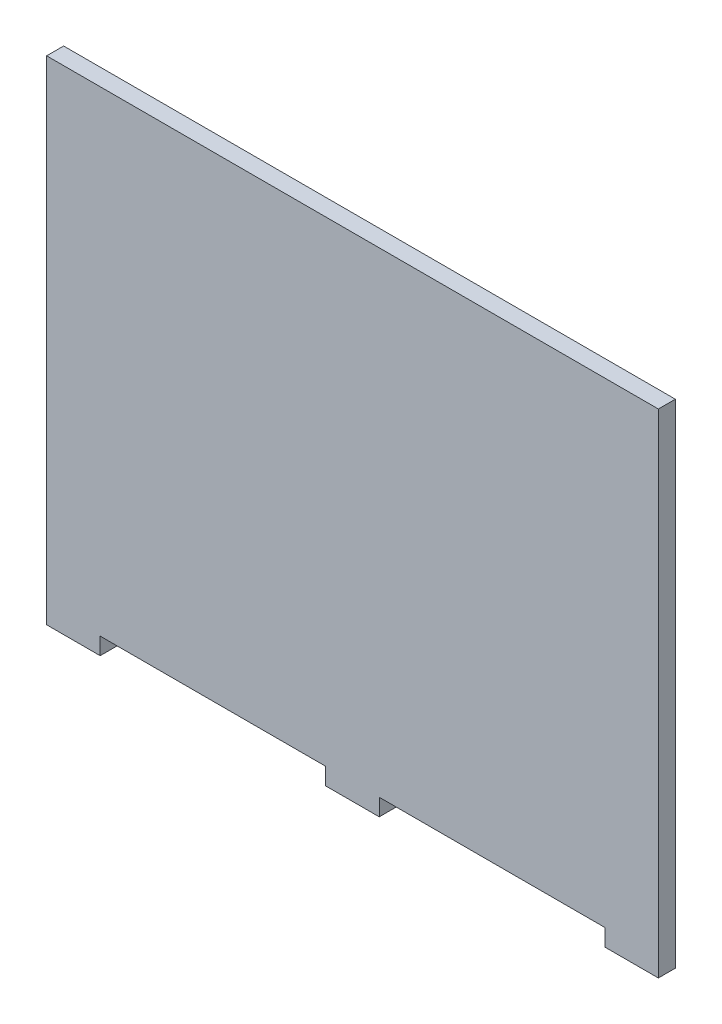
ISO-10303-21;
HEADER;
FILE_DESCRIPTION(('STEP AP214'),'2;1');
FILE_NAME('part.step','',(''),(''),'','','');
FILE_SCHEMA(('AUTOMOTIVE_DESIGN { 1 0 10303 214 1 1 1 1 }'));
ENDSEC;
DATA;
#1=APPLICATION_CONTEXT('core data for automotive mechanical design processes');
#2=APPLICATION_PROTOCOL_DEFINITION('international standard','automotive_design',2000,#1);
#3=PRODUCT_CONTEXT('',#1,'mechanical');
#4=PRODUCT('Part','Part','',(#3));
#5=PRODUCT_RELATED_PRODUCT_CATEGORY('part','',(#4));
#6=PRODUCT_DEFINITION_FORMATION('','',#4);
#7=PRODUCT_DEFINITION_CONTEXT('part definition',#1,'design');
#8=PRODUCT_DEFINITION('design','',#6,#7);
#9=PRODUCT_DEFINITION_SHAPE('','',#8);
#10=(LENGTH_UNIT() NAMED_UNIT(*) SI_UNIT(.MILLI.,.METRE.));
#11=(NAMED_UNIT(*) PLANE_ANGLE_UNIT() SI_UNIT($,.RADIAN.));
#12=(NAMED_UNIT(*) SI_UNIT($,.STERADIAN.) SOLID_ANGLE_UNIT());
#13=UNCERTAINTY_MEASURE_WITH_UNIT(LENGTH_MEASURE(1.E-05),#10,'distance_accuracy_value','');
#14=(GEOMETRIC_REPRESENTATION_CONTEXT(3) GLOBAL_UNCERTAINTY_ASSIGNED_CONTEXT((#13)) GLOBAL_UNIT_ASSIGNED_CONTEXT((#10,
#11,#12)) REPRESENTATION_CONTEXT('',''));
#15=CARTESIAN_POINT('',(0.,0.,0.));
#16=DIRECTION('',(0.,0.,1.));
#17=DIRECTION('',(1.,0.,0.));
#18=AXIS2_PLACEMENT_3D('',#15,#16,#17);
#19=CARTESIAN_POINT('',(114.3,0.,-6.35));
#20=DIRECTION('',(1.,0.,0.));
#21=DIRECTION('',(0.,0.,-1.));
#22=AXIS2_PLACEMENT_3D('',#19,#20,#21);
#23=PLANE('',#22);
#24=DIRECTION('',(0.,1.,0.));
#25=VECTOR('',#24,1.);
#26=CARTESIAN_POINT('',(114.3,0.,0.));
#27=LINE('',#26,#25);
#28=CARTESIAN_POINT('',(114.3,-6.35,0.));
#29=VERTEX_POINT('',#28);
#30=CARTESIAN_POINT('',(114.3,177.8,0.));
#31=VERTEX_POINT('',#30);
#32=EDGE_CURVE('E152',#29,#31,#27,.T.);
#33=ORIENTED_EDGE('',*,*,#32,.F.);
#34=DIRECTION('',(0.,0.,1.));
#35=VECTOR('',#34,1.);
#36=CARTESIAN_POINT('',(114.3,-6.35,-6.35));
#37=LINE('',#36,#35);
#38=CARTESIAN_POINT('',(114.3,-6.35,-6.35));
#39=VERTEX_POINT('',#38);
#40=EDGE_CURVE('E11',#39,#29,#37,.T.);
#41=ORIENTED_EDGE('',*,*,#40,.F.);
#42=DIRECTION('',(0.,1.,0.));
#43=VECTOR('',#42,1.);
#44=CARTESIAN_POINT('',(114.3,0.,-6.35));
#45=LINE('',#44,#43);
#46=CARTESIAN_POINT('',(114.3,177.8,-6.35));
#47=VERTEX_POINT('',#46);
#48=EDGE_CURVE('E182',#39,#47,#45,.T.);
#49=ORIENTED_EDGE('',*,*,#48,.T.);
#50=DIRECTION('',(0.,0.,1.));
#51=VECTOR('',#50,1.);
#52=CARTESIAN_POINT('',(114.3,177.8,-6.35));
#53=LINE('',#52,#51);
#54=EDGE_CURVE('E38',#47,#31,#53,.T.);
#55=ORIENTED_EDGE('',*,*,#54,.T.);
#56=EDGE_LOOP('',(#33,#41,#49,#55));
#57=FACE_BOUND('',#56,.T.);
#58=ADVANCED_FACE('F35',(#57),#23,.T.);
#59=CARTESIAN_POINT('',(0.,-6.35,-6.35));
#60=DIRECTION('',(0.,-1.,0.));
#61=DIRECTION('',(0.,0.,-1.));
#62=AXIS2_PLACEMENT_3D('',#59,#60,#61);
#63=PLANE('',#62);
#64=DIRECTION('',(1.,0.,0.));
#65=VECTOR('',#64,1.);
#66=CARTESIAN_POINT('',(0.,-6.35,0.));
#67=LINE('',#66,#65);
#68=CARTESIAN_POINT('',(94.3,-6.35,0.));
#69=VERTEX_POINT('',#68);
#70=EDGE_CURVE('E180',#69,#29,#67,.T.);
#71=ORIENTED_EDGE('',*,*,#70,.F.);
#72=DIRECTION('',(0.,0.,1.));
#73=VECTOR('',#72,1.);
#74=CARTESIAN_POINT('',(94.3,-6.35,-6.35));
#75=LINE('',#74,#73);
#76=CARTESIAN_POINT('',(94.3,-6.35,-6.35));
#77=VERTEX_POINT('',#76);
#78=EDGE_CURVE('E44',#77,#69,#75,.T.);
#79=ORIENTED_EDGE('',*,*,#78,.F.);
#80=DIRECTION('',(1.,0.,0.));
#81=VECTOR('',#80,1.);
#82=CARTESIAN_POINT('',(0.,-6.35,-6.35));
#83=LINE('',#82,#81);
#84=EDGE_CURVE('E147',#77,#39,#83,.T.);
#85=ORIENTED_EDGE('',*,*,#84,.T.);
#86=ORIENTED_EDGE('',*,*,#40,.T.);
#87=EDGE_LOOP('',(#71,#79,#85,#86));
#88=FACE_BOUND('',#87,.T.);
#89=ADVANCED_FACE('F207',(#88),#63,.T.);
#90=CARTESIAN_POINT('',(94.3,0.,-6.35));
#91=DIRECTION('',(-1.,0.,0.));
#92=DIRECTION('',(0.,0.,1.));
#93=AXIS2_PLACEMENT_3D('',#90,#91,#92);
#94=PLANE('',#93);
#95=DIRECTION('',(0.,-1.,0.));
#96=VECTOR('',#95,1.);
#97=CARTESIAN_POINT('',(94.3,0.,0.));
#98=LINE('',#97,#96);
#99=CARTESIAN_POINT('',(94.3,0.,0.));
#100=VERTEX_POINT('',#99);
#101=EDGE_CURVE('E134',#100,#69,#98,.T.);
#102=ORIENTED_EDGE('',*,*,#101,.F.);
#103=DIRECTION('',(0.,0.,1.));
#104=VECTOR('',#103,1.);
#105=CARTESIAN_POINT('',(94.3,0.,-6.35));
#106=LINE('',#105,#104);
#107=CARTESIAN_POINT('',(94.3,0.,-6.35));
#108=VERTEX_POINT('',#107);
#109=EDGE_CURVE('E128',#108,#100,#106,.T.);
#110=ORIENTED_EDGE('',*,*,#109,.F.);
#111=DIRECTION('',(0.,-1.,0.));
#112=VECTOR('',#111,1.);
#113=CARTESIAN_POINT('',(94.3,0.,-6.35));
#114=LINE('',#113,#112);
#115=EDGE_CURVE('E132',#108,#77,#114,.T.);
#116=ORIENTED_EDGE('',*,*,#115,.T.);
#117=ORIENTED_EDGE('',*,*,#78,.T.);
#118=EDGE_LOOP('',(#102,#110,#116,#117));
#119=FACE_BOUND('',#118,.T.);
#120=ADVANCED_FACE('F130',(#119),#94,.T.);
#121=CARTESIAN_POINT('',(0.,0.,-6.35));
#122=DIRECTION('',(0.,1.,0.));
#123=DIRECTION('',(0.,0.,1.));
#124=AXIS2_PLACEMENT_3D('',#121,#122,#123);
#125=PLANE('',#124);
#126=DIRECTION('',(-1.,0.,0.));
#127=VECTOR('',#126,1.);
#128=CARTESIAN_POINT('',(0.,0.,0.));
#129=LINE('',#128,#127);
#130=CARTESIAN_POINT('',(9.99999999999999,0.,0.));
#131=VERTEX_POINT('',#130);
#132=EDGE_CURVE('E177',#100,#131,#129,.T.);
#133=ORIENTED_EDGE('',*,*,#132,.T.);
#134=DIRECTION('',(0.,0.,1.));
#135=VECTOR('',#134,1.);
#136=CARTESIAN_POINT('',(9.99999999999999,0.,-6.35));
#137=LINE('',#136,#135);
#138=CARTESIAN_POINT('',(9.99999999999999,0.,-6.35));
#139=VERTEX_POINT('',#138);
#140=EDGE_CURVE('E137',#139,#131,#137,.T.);
#141=ORIENTED_EDGE('',*,*,#140,.F.);
#142=DIRECTION('',(-1.,0.,0.));
#143=VECTOR('',#142,1.);
#144=CARTESIAN_POINT('',(0.,0.,-6.35));
#145=LINE('',#144,#143);
#146=EDGE_CURVE('E140',#108,#139,#145,.T.);
#147=ORIENTED_EDGE('',*,*,#146,.F.);
#148=ORIENTED_EDGE('',*,*,#109,.T.);
#149=EDGE_LOOP('',(#133,#141,#147,#148));
#150=FACE_BOUND('',#149,.T.);
#151=ADVANCED_FACE('F141',(#150),#125,.F.);
#152=CARTESIAN_POINT('',(9.99999999999999,0.,-6.35));
#153=DIRECTION('',(-1.,0.,0.));
#154=DIRECTION('',(0.,0.,1.));
#155=AXIS2_PLACEMENT_3D('',#152,#153,#154);
#156=PLANE('',#155);
#157=DIRECTION('',(0.,-1.,0.));
#158=VECTOR('',#157,1.);
#159=CARTESIAN_POINT('',(9.99999999999999,0.,0.));
#160=LINE('',#159,#158);
#161=CARTESIAN_POINT('',(9.99999999999999,-6.35,0.));
#162=VERTEX_POINT('',#161);
#163=EDGE_CURVE('E174',#131,#162,#160,.T.);
#164=ORIENTED_EDGE('',*,*,#163,.T.);
#165=DIRECTION('',(0.,0.,1.));
#166=VECTOR('',#165,1.);
#167=CARTESIAN_POINT('',(9.99999999999999,-6.35,-6.35));
#168=LINE('',#167,#166);
#169=CARTESIAN_POINT('',(9.99999999999999,-6.35,-6.35));
#170=VERTEX_POINT('',#169);
#171=EDGE_CURVE('E186',#170,#162,#168,.T.);
#172=ORIENTED_EDGE('',*,*,#171,.F.);
#173=DIRECTION('',(0.,-1.,0.));
#174=VECTOR('',#173,1.);
#175=CARTESIAN_POINT('',(9.99999999999999,0.,-6.35));
#176=LINE('',#175,#174);
#177=EDGE_CURVE('E144',#139,#170,#176,.T.);
#178=ORIENTED_EDGE('',*,*,#177,.F.);
#179=ORIENTED_EDGE('',*,*,#140,.T.);
#180=EDGE_LOOP('',(#164,#172,#178,#179));
#181=FACE_BOUND('',#180,.T.);
#182=ADVANCED_FACE('F220',(#181),#156,.F.);
#183=CARTESIAN_POINT('',(0.,-6.35,-6.35));
#184=DIRECTION('',(0.,-1.,0.));
#185=DIRECTION('',(0.,0.,-1.));
#186=AXIS2_PLACEMENT_3D('',#183,#184,#185);
#187=PLANE('',#186);
#188=DIRECTION('',(1.,0.,0.));
#189=VECTOR('',#188,1.);
#190=CARTESIAN_POINT('',(0.,-6.35,0.));
#191=LINE('',#190,#189);
#192=CARTESIAN_POINT('',(-10.,-6.35,0.));
#193=VERTEX_POINT('',#192);
#194=EDGE_CURVE('E171',#193,#162,#191,.T.);
#195=ORIENTED_EDGE('',*,*,#194,.F.);
#196=DIRECTION('',(0.,0.,1.));
#197=VECTOR('',#196,1.);
#198=CARTESIAN_POINT('',(-10.,-6.35,-6.35));
#199=LINE('',#198,#197);
#200=CARTESIAN_POINT('',(-10.,-6.35,-6.35));
#201=VERTEX_POINT('',#200);
#202=EDGE_CURVE('E188',#201,#193,#199,.T.);
#203=ORIENTED_EDGE('',*,*,#202,.F.);
#204=DIRECTION('',(1.,0.,0.));
#205=VECTOR('',#204,1.);
#206=CARTESIAN_POINT('',(0.,-6.35,-6.35));
#207=LINE('',#206,#205);
#208=EDGE_CURVE('E400',#201,#170,#207,.T.);
#209=ORIENTED_EDGE('',*,*,#208,.T.);
#210=ORIENTED_EDGE('',*,*,#171,.T.);
#211=EDGE_LOOP('',(#195,#203,#209,#210));
#212=FACE_BOUND('',#211,.T.);
#213=ADVANCED_FACE('F223',(#212),#187,.T.);
#214=CARTESIAN_POINT('',(-10.,0.,-6.35));
#215=DIRECTION('',(-1.,0.,0.));
#216=DIRECTION('',(0.,0.,1.));
#217=AXIS2_PLACEMENT_3D('',#214,#215,#216);
#218=PLANE('',#217);
#219=DIRECTION('',(0.,-1.,0.));
#220=VECTOR('',#219,1.);
#221=CARTESIAN_POINT('',(-10.,0.,0.));
#222=LINE('',#221,#220);
#223=CARTESIAN_POINT('',(-10.,0.,0.));
#224=VERTEX_POINT('',#223);
#225=EDGE_CURVE('E168',#224,#193,#222,.T.);
#226=ORIENTED_EDGE('',*,*,#225,.F.);
#227=DIRECTION('',(0.,0.,1.));
#228=VECTOR('',#227,1.);
#229=CARTESIAN_POINT('',(-10.,0.,-6.35));
#230=LINE('',#229,#228);
#231=CARTESIAN_POINT('',(-10.,0.,-6.35));
#232=VERTEX_POINT('',#231);
#233=EDGE_CURVE('E190',#232,#224,#230,.T.);
#234=ORIENTED_EDGE('',*,*,#233,.F.);
#235=DIRECTION('',(0.,-1.,0.));
#236=VECTOR('',#235,1.);
#237=CARTESIAN_POINT('',(-10.,0.,-6.35));
#238=LINE('',#237,#236);
#239=EDGE_CURVE('E395',#232,#201,#238,.T.);
#240=ORIENTED_EDGE('',*,*,#239,.T.);
#241=ORIENTED_EDGE('',*,*,#202,.T.);
#242=EDGE_LOOP('',(#226,#234,#240,#241));
#243=FACE_BOUND('',#242,.T.);
#244=ADVANCED_FACE('F227',(#243),#218,.T.);
#245=CARTESIAN_POINT('',(0.,0.,-6.35));
#246=DIRECTION('',(0.,1.,0.));
#247=DIRECTION('',(0.,0.,1.));
#248=AXIS2_PLACEMENT_3D('',#245,#246,#247);
#249=PLANE('',#248);
#250=DIRECTION('',(-1.,0.,0.));
#251=VECTOR('',#250,1.);
#252=CARTESIAN_POINT('',(0.,0.,0.));
#253=LINE('',#252,#251);
#254=CARTESIAN_POINT('',(-94.3,0.,0.));
#255=VERTEX_POINT('',#254);
#256=EDGE_CURVE('E166',#224,#255,#253,.T.);
#257=ORIENTED_EDGE('',*,*,#256,.T.);
#258=DIRECTION('',(0.,0.,1.));
#259=VECTOR('',#258,1.);
#260=CARTESIAN_POINT('',(-94.3,0.,-6.35));
#261=LINE('',#260,#259);
#262=CARTESIAN_POINT('',(-94.3,0.,-6.35));
#263=VERTEX_POINT('',#262);
#264=EDGE_CURVE('E192',#263,#255,#261,.T.);
#265=ORIENTED_EDGE('',*,*,#264,.F.);
#266=DIRECTION('',(-1.,0.,0.));
#267=VECTOR('',#266,1.);
#268=CARTESIAN_POINT('',(0.,0.,-6.35));
#269=LINE('',#268,#267);
#270=EDGE_CURVE('E404',#232,#263,#269,.T.);
#271=ORIENTED_EDGE('',*,*,#270,.F.);
#272=ORIENTED_EDGE('',*,*,#233,.T.);
#273=EDGE_LOOP('',(#257,#265,#271,#272));
#274=FACE_BOUND('',#273,.T.);
#275=ADVANCED_FACE('F231',(#274),#249,.F.);
#276=CARTESIAN_POINT('',(-94.3,0.,-6.35));
#277=DIRECTION('',(-1.,0.,0.));
#278=DIRECTION('',(0.,0.,1.));
#279=AXIS2_PLACEMENT_3D('',#276,#277,#278);
#280=PLANE('',#279);
#281=DIRECTION('',(0.,-1.,0.));
#282=VECTOR('',#281,1.);
#283=CARTESIAN_POINT('',(-94.3,0.,0.));
#284=LINE('',#283,#282);
#285=CARTESIAN_POINT('',(-94.3,-6.35,0.));
#286=VERTEX_POINT('',#285);
#287=EDGE_CURVE('E163',#255,#286,#284,.T.);
#288=ORIENTED_EDGE('',*,*,#287,.T.);
#289=DIRECTION('',(0.,0.,1.));
#290=VECTOR('',#289,1.);
#291=CARTESIAN_POINT('',(-94.3,-6.35,-6.35));
#292=LINE('',#291,#290);
#293=CARTESIAN_POINT('',(-94.3,-6.35,-6.35));
#294=VERTEX_POINT('',#293);
#295=EDGE_CURVE('E195',#294,#286,#292,.T.);
#296=ORIENTED_EDGE('',*,*,#295,.F.);
#297=DIRECTION('',(0.,-1.,0.));
#298=VECTOR('',#297,1.);
#299=CARTESIAN_POINT('',(-94.3,0.,-6.35));
#300=LINE('',#299,#298);
#301=EDGE_CURVE('E406',#263,#294,#300,.T.);
#302=ORIENTED_EDGE('',*,*,#301,.F.);
#303=ORIENTED_EDGE('',*,*,#264,.T.);
#304=EDGE_LOOP('',(#288,#296,#302,#303));
#305=FACE_BOUND('',#304,.T.);
#306=ADVANCED_FACE('F235',(#305),#280,.F.);
#307=CARTESIAN_POINT('',(0.,-6.35,-6.35));
#308=DIRECTION('',(0.,-1.,0.));
#309=DIRECTION('',(0.,0.,-1.));
#310=AXIS2_PLACEMENT_3D('',#307,#308,#309);
#311=PLANE('',#310);
#312=DIRECTION('',(1.,0.,0.));
#313=VECTOR('',#312,1.);
#314=CARTESIAN_POINT('',(0.,-6.35,0.));
#315=LINE('',#314,#313);
#316=CARTESIAN_POINT('',(-114.3,-6.35,0.));
#317=VERTEX_POINT('',#316);
#318=EDGE_CURVE('E160',#317,#286,#315,.T.);
#319=ORIENTED_EDGE('',*,*,#318,.F.);
#320=DIRECTION('',(0.,0.,1.));
#321=VECTOR('',#320,1.);
#322=CARTESIAN_POINT('',(-114.3,-6.35,-6.35));
#323=LINE('',#322,#321);
#324=CARTESIAN_POINT('',(-114.3,-6.35,-6.35));
#325=VERTEX_POINT('',#324);
#326=EDGE_CURVE('E197',#325,#317,#323,.T.);
#327=ORIENTED_EDGE('',*,*,#326,.F.);
#328=DIRECTION('',(1.,0.,0.));
#329=VECTOR('',#328,1.);
#330=CARTESIAN_POINT('',(0.,-6.35,-6.35));
#331=LINE('',#330,#329);
#332=EDGE_CURVE('E386',#325,#294,#331,.T.);
#333=ORIENTED_EDGE('',*,*,#332,.T.);
#334=ORIENTED_EDGE('',*,*,#295,.T.);
#335=EDGE_LOOP('',(#319,#327,#333,#334));
#336=FACE_BOUND('',#335,.T.);
#337=ADVANCED_FACE('F239',(#336),#311,.T.);
#338=CARTESIAN_POINT('',(-114.3,0.,-6.35));
#339=DIRECTION('',(1.,0.,0.));
#340=DIRECTION('',(0.,0.,-1.));
#341=AXIS2_PLACEMENT_3D('',#338,#339,#340);
#342=PLANE('',#341);
#343=DIRECTION('',(0.,1.,0.));
#344=VECTOR('',#343,1.);
#345=CARTESIAN_POINT('',(-114.3,0.,0.));
#346=LINE('',#345,#344);
#347=CARTESIAN_POINT('',(-114.3,177.8,0.));
#348=VERTEX_POINT('',#347);
#349=EDGE_CURVE('E158',#317,#348,#346,.T.);
#350=ORIENTED_EDGE('',*,*,#349,.T.);
#351=DIRECTION('',(0.,0.,1.));
#352=VECTOR('',#351,1.);
#353=CARTESIAN_POINT('',(-114.3,177.8,-6.35));
#354=LINE('',#353,#352);
#355=CARTESIAN_POINT('',(-114.3,177.8,-6.35));
#356=VERTEX_POINT('',#355);
#357=EDGE_CURVE('E198',#356,#348,#354,.T.);
#358=ORIENTED_EDGE('',*,*,#357,.F.);
#359=DIRECTION('',(0.,1.,0.));
#360=VECTOR('',#359,1.);
#361=CARTESIAN_POINT('',(-114.3,0.,-6.35));
#362=LINE('',#361,#360);
#363=EDGE_CURVE('E409',#325,#356,#362,.T.);
#364=ORIENTED_EDGE('',*,*,#363,.F.);
#365=ORIENTED_EDGE('',*,*,#326,.T.);
#366=EDGE_LOOP('',(#350,#358,#364,#365));
#367=FACE_BOUND('',#366,.T.);
#368=ADVANCED_FACE('F243',(#367),#342,.F.);
#369=CARTESIAN_POINT('',(0.,177.8,-6.35));
#370=DIRECTION('',(0.,-1.,0.));
#371=DIRECTION('',(0.,0.,-1.));
#372=AXIS2_PLACEMENT_3D('',#369,#370,#371);
#373=PLANE('',#372);
#374=DIRECTION('',(1.,0.,0.));
#375=VECTOR('',#374,1.);
#376=CARTESIAN_POINT('',(0.,177.8,0.));
#377=LINE('',#376,#375);
#378=EDGE_CURVE('E155',#348,#31,#377,.T.);
#379=ORIENTED_EDGE('',*,*,#378,.T.);
#380=ORIENTED_EDGE('',*,*,#54,.F.);
#381=DIRECTION('',(1.,0.,0.));
#382=VECTOR('',#381,1.);
#383=CARTESIAN_POINT('',(0.,177.8,-6.35));
#384=LINE('',#383,#382);
#385=EDGE_CURVE('E103',#356,#47,#384,.T.);
#386=ORIENTED_EDGE('',*,*,#385,.F.);
#387=ORIENTED_EDGE('',*,*,#357,.T.);
#388=EDGE_LOOP('',(#379,#380,#386,#387));
#389=FACE_BOUND('',#388,.T.);
#390=ADVANCED_FACE('F203',(#389),#373,.F.);
#391=CARTESIAN_POINT('',(0.,0.,-6.35));
#392=DIRECTION('',(0.,0.,1.));
#393=DIRECTION('',(1.,0.,0.));
#394=AXIS2_PLACEMENT_3D('',#391,#392,#393);
#395=PLANE('',#394);
#396=ORIENTED_EDGE('',*,*,#48,.F.);
#397=ORIENTED_EDGE('',*,*,#84,.F.);
#398=ORIENTED_EDGE('',*,*,#115,.F.);
#399=ORIENTED_EDGE('',*,*,#146,.T.);
#400=ORIENTED_EDGE('',*,*,#177,.T.);
#401=ORIENTED_EDGE('',*,*,#208,.F.);
#402=ORIENTED_EDGE('',*,*,#239,.F.);
#403=ORIENTED_EDGE('',*,*,#270,.T.);
#404=ORIENTED_EDGE('',*,*,#301,.T.);
#405=ORIENTED_EDGE('',*,*,#332,.F.);
#406=ORIENTED_EDGE('',*,*,#363,.T.);
#407=ORIENTED_EDGE('',*,*,#385,.T.);
#408=EDGE_LOOP('',(#396,#397,#398,#399,#400,#401,#402,#403,#404,#405,#406,#407));
#409=FACE_BOUND('',#408,.T.);
#410=ADVANCED_FACE('F146',(#409),#395,.F.);
#411=CARTESIAN_POINT('',(0.,0.,0.));
#412=DIRECTION('',(0.,0.,1.));
#413=DIRECTION('',(1.,0.,0.));
#414=AXIS2_PLACEMENT_3D('',#411,#412,#413);
#415=PLANE('',#414);
#416=ORIENTED_EDGE('',*,*,#32,.T.);
#417=ORIENTED_EDGE('',*,*,#378,.F.);
#418=ORIENTED_EDGE('',*,*,#349,.F.);
#419=ORIENTED_EDGE('',*,*,#318,.T.);
#420=ORIENTED_EDGE('',*,*,#287,.F.);
#421=ORIENTED_EDGE('',*,*,#256,.F.);
#422=ORIENTED_EDGE('',*,*,#225,.T.);
#423=ORIENTED_EDGE('',*,*,#194,.T.);
#424=ORIENTED_EDGE('',*,*,#163,.F.);
#425=ORIENTED_EDGE('',*,*,#132,.F.);
#426=ORIENTED_EDGE('',*,*,#101,.T.);
#427=ORIENTED_EDGE('',*,*,#70,.T.);
#428=EDGE_LOOP('',(#416,#417,#418,#419,#420,#421,#422,#423,#424,#425,#426,#427));
#429=FACE_BOUND('',#428,.T.);
#430=ADVANCED_FACE('F206',(#429),#415,.T.);
#431=CLOSED_SHELL('',(#58,#89,#120,#151,#182,#213,#244,#275,#306,#337,#368,#390,#410,#430));
#432=MANIFOLD_SOLID_BREP('B2',#431);
#433=ADVANCED_BREP_SHAPE_REPRESENTATION('',(#18,#432),#14);
#434=SHAPE_DEFINITION_REPRESENTATION(#9,#433);
ENDSEC;
END-ISO-10303-21;
